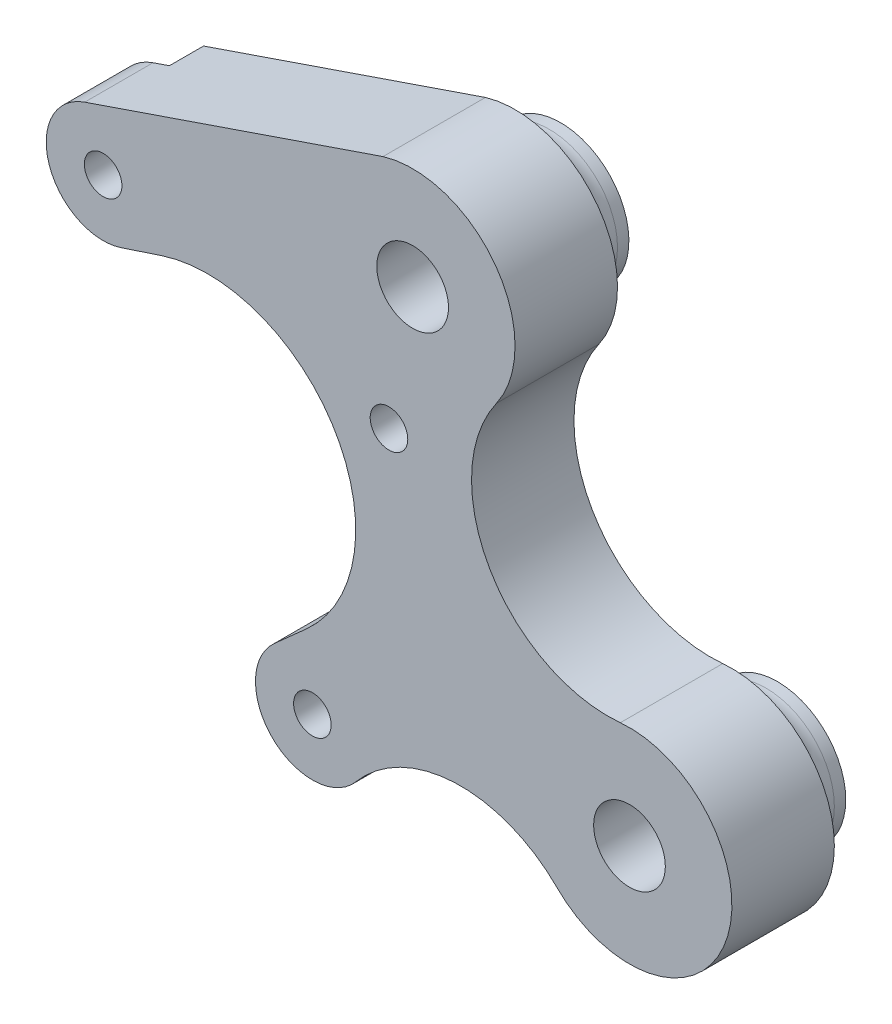
ISO-10303-21;
HEADER;
FILE_DESCRIPTION(('STEP AP214'),'2;1');
FILE_NAME('part.step','',(''),(''),'','','');
FILE_SCHEMA(('AUTOMOTIVE_DESIGN { 1 0 10303 214 1 1 1 1 }'));
ENDSEC;
DATA;
#1=APPLICATION_CONTEXT('core data for automotive mechanical design processes');
#2=APPLICATION_PROTOCOL_DEFINITION('international standard','automotive_design',2000,#1);
#3=PRODUCT_CONTEXT('',#1,'mechanical');
#4=PRODUCT('Part','Part','',(#3));
#5=PRODUCT_RELATED_PRODUCT_CATEGORY('part','',(#4));
#6=PRODUCT_DEFINITION_FORMATION('','',#4);
#7=PRODUCT_DEFINITION_CONTEXT('part definition',#1,'design');
#8=PRODUCT_DEFINITION('design','',#6,#7);
#9=PRODUCT_DEFINITION_SHAPE('','',#8);
#10=(LENGTH_UNIT() NAMED_UNIT(*) SI_UNIT(.MILLI.,.METRE.));
#11=(NAMED_UNIT(*) PLANE_ANGLE_UNIT() SI_UNIT($,.RADIAN.));
#12=(NAMED_UNIT(*) SI_UNIT($,.STERADIAN.) SOLID_ANGLE_UNIT());
#13=UNCERTAINTY_MEASURE_WITH_UNIT(LENGTH_MEASURE(1.E-05),#10,'distance_accuracy_value','');
#14=(GEOMETRIC_REPRESENTATION_CONTEXT(3) GLOBAL_UNCERTAINTY_ASSIGNED_CONTEXT((#13)) GLOBAL_UNIT_ASSIGNED_CONTEXT((#10,
#11,#12)) REPRESENTATION_CONTEXT('',''));
#15=CARTESIAN_POINT('',(0.,0.,0.));
#16=DIRECTION('',(0.,0.,1.));
#17=DIRECTION('',(1.,0.,0.));
#18=AXIS2_PLACEMENT_3D('',#15,#16,#17);
#19=CARTESIAN_POINT('',(22.2096894601271,-26.8555694964484,0.));
#20=DIRECTION('',(0.,0.,1.));
#21=DIRECTION('',(1.,0.,0.));
#22=AXIS2_PLACEMENT_3D('',#19,#20,#21);
#23=PLANE('',#22);
#24=DIRECTION('',(-0.946197404483314,-0.323589974735066,0.));
#25=VECTOR('',#24,1.);
#26=CARTESIAN_POINT('',(15.3980537674445,29.6156761663198,0.));
#27=LINE('',#26,#25);
#28=CARTESIAN_POINT('',(14.7811488401448,29.4047008995382,0.));
#29=VERTEX_POINT('',#28);
#30=CARTESIAN_POINT('',(-9.36933806097773,21.1454778144345,0.));
#31=VERTEX_POINT('',#30);
#32=EDGE_CURVE('E268',#29,#31,#27,.T.);
#33=ORIENTED_EDGE('',*,*,#32,.F.);
#34=CARTESIAN_POINT('',(18.,21.,0.));
#35=DIRECTION('',(0.,0.,1.));
#36=DIRECTION('',(1.,0.,0.));
#37=AXIS2_PLACEMENT_3D('',#34,#35,#36);
#38=CIRCLE('',#37,9.);
#39=CARTESIAN_POINT('',(10.6716496999678,15.7755113283673,0.));
#40=VERTEX_POINT('',#39);
#41=EDGE_CURVE('E312',#29,#40,#38,.T.);
#42=ORIENTED_EDGE('',*,*,#41,.T.);
#43=DIRECTION('',(0.96592582628907,-0.258819045102514,0.));
#44=VECTOR('',#43,1.);
#45=CARTESIAN_POINT('',(-10.7960704087799,21.5277695948435,0.));
#46=LINE('',#45,#44);
#47=EDGE_CURVE('E184',#31,#40,#46,.T.);
#48=ORIENTED_EDGE('',*,*,#47,.F.);
#49=EDGE_LOOP('',(#33,#42,#48));
#50=FACE_BOUND('',#49,.T.);
#51=ADVANCED_FACE('F35',(#50),#23,.F.);
#52=CARTESIAN_POINT('',(35.1748892784926,8.915994940769,0.));
#53=DIRECTION('',(0.,0.,-1.));
#54=DIRECTION('',(1.,0.,0.));
#55=AXIS2_PLACEMENT_3D('',#52,#53,#54);
#56=CIRCLE('',#55,12.);
#57=CARTESIAN_POINT('',(36.2478096907825,-3.03594388893104,0.));
#58=VERTEX_POINT('',#57);
#59=CARTESIAN_POINT('',(25.3606668336397,15.821140688901,0.));
#60=VERTEX_POINT('',#59);
#61=EDGE_CURVE('E263',#58,#60,#56,.T.);
#62=ORIENTED_EDGE('',*,*,#61,.F.);
#63=CARTESIAN_POINT('',(37.0524999999999,-11.9998980112061,0.));
#64=DIRECTION('',(0.,0.,1.));
#65=DIRECTION('',(1.,0.,0.));
#66=AXIS2_PLACEMENT_3D('',#63,#64,#65);
#67=CIRCLE('',#66,9.);
#68=CARTESIAN_POINT('',(30.6912954829116,-18.3666143620242,0.));
#69=VERTEX_POINT('',#68);
#70=EDGE_CURVE('E314',#58,#69,#67,.T.);
#71=ORIENTED_EDGE('',*,*,#70,.T.);
#72=CARTESIAN_POINT('',(22.2096894601271,-26.8555694964484,0.));
#73=DIRECTION('',(0.,0.,-1.));
#74=DIRECTION('',(1.,0.,0.));
#75=AXIS2_PLACEMENT_3D('',#72,#73,#74);
#76=CIRCLE('',#75,12.);
#77=CARTESIAN_POINT('',(13.7083588517206,-18.3863677698056,0.));
#78=VERTEX_POINT('',#77);
#79=EDGE_CURVE('E183',#78,#69,#76,.T.);
#80=ORIENTED_EDGE('',*,*,#79,.F.);
#81=DIRECTION('',(-0.258819045102514,-0.96592582628907,0.));
#82=VECTOR('',#81,1.);
#83=CARTESIAN_POINT('',(21.5277695948435,10.7960704087799,0.));
#84=LINE('',#83,#82);
#85=CARTESIAN_POINT('',(21.5277695948435,10.7960704087799,0.));
#86=VERTEX_POINT('',#85);
#87=EDGE_CURVE('E166',#86,#78,#84,.T.);
#88=ORIENTED_EDGE('',*,*,#87,.F.);
#89=DIRECTION('',(0.500000000000005,-0.866025403784436,0.));
#90=VECTOR('',#89,1.);
#91=CARTESIAN_POINT('',(20.1135560324704,13.245560151563,0.));
#92=LINE('',#91,#90);
#93=CARTESIAN_POINT('',(20.6094760717162,12.3866014470977,0.));
#94=VERTEX_POINT('',#93);
#95=EDGE_CURVE('E158',#94,#86,#92,.T.);
#96=ORIENTED_EDGE('',*,*,#95,.F.);
#97=CARTESIAN_POINT('',(18.,21.,0.));
#98=DIRECTION('',(0.,0.,1.));
#99=DIRECTION('',(1.,0.,0.));
#100=AXIS2_PLACEMENT_3D('',#97,#98,#99);
#101=CIRCLE('',#100,9.);
#102=EDGE_CURVE('E310',#94,#60,#101,.T.);
#103=ORIENTED_EDGE('',*,*,#102,.T.);
#104=EDGE_LOOP('',(#62,#71,#80,#88,#96,#103));
#105=FACE_BOUND('',#104,.T.);
#106=ADVANCED_FACE('F180',(#105),#23,.F.);
#107=CARTESIAN_POINT('',(22.2096894601271,-26.8555694964484,9.));
#108=DIRECTION('',(0.,0.,1.));
#109=DIRECTION('',(1.,0.,0.));
#110=AXIS2_PLACEMENT_3D('',#107,#108,#109);
#111=PLANE('',#110);
#112=CARTESIAN_POINT('',(18.,21.,9.));
#113=DIRECTION('',(0.,0.,1.));
#114=DIRECTION('',(1.,0.,0.));
#115=AXIS2_PLACEMENT_3D('',#112,#113,#114);
#116=CIRCLE('',#115,3.15);
#117=CARTESIAN_POINT('',(21.15,21.,9.));
#118=VERTEX_POINT('',#117);
#119=EDGE_CURVE('E225',#118,#118,#116,.T.);
#120=ORIENTED_EDGE('',*,*,#119,.F.);
#121=EDGE_LOOP('',(#120));
#122=FACE_BOUND('',#121,.T.);
#123=CARTESIAN_POINT('',(15.9216833280906,9.19238815542522,9.));
#124=DIRECTION('',(0.,0.,1.));
#125=DIRECTION('',(1.,0.,0.));
#126=AXIS2_PLACEMENT_3D('',#123,#124,#125);
#127=CIRCLE('',#126,1.65);
#128=CARTESIAN_POINT('',(17.5716833280906,9.19238815542522,9.));
#129=VERTEX_POINT('',#128);
#130=EDGE_CURVE('E231',#129,#129,#127,.T.);
#131=ORIENTED_EDGE('',*,*,#130,.F.);
#132=EDGE_LOOP('',(#131));
#133=FACE_BOUND('',#132,.T.);
#134=CARTESIAN_POINT('',(22.2096894601271,-26.8555694964484,9.));
#135=DIRECTION('',(0.,0.,-1.));
#136=DIRECTION('',(1.,0.,0.));
#137=AXIS2_PLACEMENT_3D('',#134,#135,#136);
#138=CIRCLE('',#137,12.);
#139=CARTESIAN_POINT('',(13.0210061862199,-19.137532201137,9.));
#140=VERTEX_POINT('',#139);
#141=CARTESIAN_POINT('',(30.6912954829116,-18.3666143620242,9.));
#142=VERTEX_POINT('',#141);
#143=EDGE_CURVE('E237',#140,#142,#138,.T.);
#144=ORIENTED_EDGE('',*,*,#143,.T.);
#145=CARTESIAN_POINT('',(37.0524999999999,-11.9998980112061,9.));
#146=DIRECTION('',(0.,0.,1.));
#147=DIRECTION('',(1.,0.,0.));
#148=AXIS2_PLACEMENT_3D('',#145,#146,#147);
#149=CIRCLE('',#148,9.);
#150=CARTESIAN_POINT('',(36.2478096907825,-3.03594388893104,9.));
#151=VERTEX_POINT('',#150);
#152=EDGE_CURVE('E240',#142,#151,#149,.T.);
#153=ORIENTED_EDGE('',*,*,#152,.T.);
#154=CARTESIAN_POINT('',(35.1748892784926,8.915994940769,9.));
#155=DIRECTION('',(0.,0.,-1.));
#156=DIRECTION('',(1.,0.,0.));
#157=AXIS2_PLACEMENT_3D('',#154,#155,#156);
#158=CIRCLE('',#157,12.);
#159=CARTESIAN_POINT('',(25.3606668336397,15.821140688901,9.));
#160=VERTEX_POINT('',#159);
#161=EDGE_CURVE('E243',#151,#160,#158,.T.);
#162=ORIENTED_EDGE('',*,*,#161,.T.);
#163=CARTESIAN_POINT('',(18.,21.,9.));
#164=DIRECTION('',(0.,0.,1.));
#165=DIRECTION('',(1.,0.,0.));
#166=AXIS2_PLACEMENT_3D('',#163,#164,#165);
#167=CIRCLE('',#166,9.);
#168=CARTESIAN_POINT('',(15.3980537674445,29.6156761663198,9.));
#169=VERTEX_POINT('',#168);
#170=EDGE_CURVE('E245',#160,#169,#167,.T.);
#171=ORIENTED_EDGE('',*,*,#170,.T.);
#172=DIRECTION('',(-0.946197404483314,-0.323589974735066,0.));
#173=VECTOR('',#172,1.);
#174=CARTESIAN_POINT('',(15.3980537674445,29.6156761663198,9.));
#175=LINE('',#174,#173);
#176=CARTESIAN_POINT('',(-10.8103380291006,20.6526703505072,9.));
#177=VERTEX_POINT('',#176);
#178=EDGE_CURVE('E247',#169,#177,#175,.T.);
#179=ORIENTED_EDGE('',*,*,#178,.T.);
#180=CARTESIAN_POINT('',(-9.19238815542523,15.9216833280906,9.));
#181=DIRECTION('',(0.,0.,1.));
#182=DIRECTION('',(1.,0.,0.));
#183=AXIS2_PLACEMENT_3D('',#180,#181,#182);
#184=CIRCLE('',#183,5.);
#185=CARTESIAN_POINT('',(-7.62597539265558,11.1733835211458,9.));
#186=VERTEX_POINT('',#185);
#187=EDGE_CURVE('E249',#177,#186,#184,.T.);
#188=ORIENTED_EDGE('',*,*,#187,.T.);
#189=DIRECTION('',(0.949659961388967,0.313282552553928,0.));
#190=VECTOR('',#189,1.);
#191=CARTESIAN_POINT('',(-4.07267318320107,12.3455794980566,9.));
#192=LINE('',#191,#190);
#193=CARTESIAN_POINT('',(-4.07267318320107,12.3455794980566,9.));
#194=VERTEX_POINT('',#193);
#195=EDGE_CURVE('E251',#186,#194,#192,.T.);
#196=ORIENTED_EDGE('',*,*,#195,.T.);
#197=CARTESIAN_POINT('',(0.,0.,9.));
#198=DIRECTION('',(0.,0.,-1.));
#199=DIRECTION('',(1.,0.,0.));
#200=AXIS2_PLACEMENT_3D('',#197,#198,#199);
#201=CIRCLE('',#200,13.);
#202=CARTESIAN_POINT('',(8.65524887815692,-9.69982818699195,9.));
#203=VERTEX_POINT('',#202);
#204=EDGE_CURVE('E253',#194,#203,#201,.T.);
#205=ORIENTED_EDGE('',*,*,#204,.T.);
#206=DIRECTION('',(-0.746140629768612,-0.665788375242839,0.));
#207=VECTOR('',#206,1.);
#208=CARTESIAN_POINT('',(8.65524887815692,-9.69982818699195,9.));
#209=LINE('',#208,#207);
#210=CARTESIAN_POINT('',(5.86344627921102,-12.1909801792475,9.));
#211=VERTEX_POINT('',#210);
#212=EDGE_CURVE('E255',#203,#211,#209,.T.);
#213=ORIENTED_EDGE('',*,*,#212,.T.);
#214=CARTESIAN_POINT('',(9.19238815542522,-15.9216833280906,9.));
#215=DIRECTION('',(0.,0.,1.));
#216=DIRECTION('',(1.,0.,0.));
#217=AXIS2_PLACEMENT_3D('',#214,#215,#216);
#218=CIRCLE('',#217,5.);
#219=EDGE_CURVE('E257',#211,#140,#218,.T.);
#220=ORIENTED_EDGE('',*,*,#219,.T.);
#221=EDGE_LOOP('',(#144,#153,#162,#171,#179,#188,#196,#205,#213,#220));
#222=FACE_BOUND('',#221,.T.);
#223=CARTESIAN_POINT('',(-9.19238815542523,15.9216833280906,9.));
#224=DIRECTION('',(0.,0.,1.));
#225=DIRECTION('',(1.,0.,0.));
#226=AXIS2_PLACEMENT_3D('',#223,#224,#225);
#227=CIRCLE('',#226,1.65);
#228=CARTESIAN_POINT('',(-7.54238815542522,15.9216833280906,9.));
#229=VERTEX_POINT('',#228);
#230=EDGE_CURVE('E234',#229,#229,#227,.T.);
#231=ORIENTED_EDGE('',*,*,#230,.F.);
#232=EDGE_LOOP('',(#231));
#233=FACE_BOUND('',#232,.T.);
#234=CARTESIAN_POINT('',(9.19238815542522,-15.9216833280906,9.));
#235=DIRECTION('',(0.,0.,1.));
#236=DIRECTION('',(1.,0.,0.));
#237=AXIS2_PLACEMENT_3D('',#234,#235,#236);
#238=CIRCLE('',#237,1.65);
#239=CARTESIAN_POINT('',(10.8423881554252,-15.9216833280906,9.));
#240=VERTEX_POINT('',#239);
#241=EDGE_CURVE('E228',#240,#240,#238,.T.);
#242=ORIENTED_EDGE('',*,*,#241,.F.);
#243=EDGE_LOOP('',(#242));
#244=FACE_BOUND('',#243,.T.);
#245=CARTESIAN_POINT('',(37.0524999999999,-11.9998980112061,9.));
#246=DIRECTION('',(0.,0.,1.));
#247=DIRECTION('',(1.,0.,0.));
#248=AXIS2_PLACEMENT_3D('',#245,#246,#247);
#249=CIRCLE('',#248,3.14999999999999);
#250=CARTESIAN_POINT('',(40.2024999999999,-11.9998980112061,9.));
#251=VERTEX_POINT('',#250);
#252=EDGE_CURVE('E222',#251,#251,#249,.T.);
#253=ORIENTED_EDGE('',*,*,#252,.F.);
#254=EDGE_LOOP('',(#253));
#255=FACE_BOUND('',#254,.T.);
#256=ADVANCED_FACE('F398',(#122,#133,#222,#233,#244,#255),#111,.T.);
#257=CARTESIAN_POINT('',(22.2096894601271,-26.8555694964484,9.));
#258=DIRECTION('',(0.,0.,-1.));
#259=DIRECTION('',(-1.,0.,0.));
#260=AXIS2_PLACEMENT_3D('',#257,#258,#259);
#261=CYLINDRICAL_SURFACE('',#260,12.);
#262=DIRECTION('',(0.,0.,-1.));
#263=VECTOR('',#262,1.);
#264=CARTESIAN_POINT('',(13.0210061862199,-19.137532201137,9.));
#265=LINE('',#264,#263);
#266=CARTESIAN_POINT('',(13.0210061862199,-19.137532201137,3.));
#267=VERTEX_POINT('',#266);
#268=EDGE_CURVE('E259',#140,#267,#265,.T.);
#269=ORIENTED_EDGE('',*,*,#268,.T.);
#270=CARTESIAN_POINT('',(22.2096894601271,-26.8555694964484,3.));
#271=DIRECTION('',(0.,0.,1.));
#272=DIRECTION('',(1.,0.,0.));
#273=AXIS2_PLACEMENT_3D('',#270,#271,#272);
#274=CIRCLE('',#273,12.);
#275=CARTESIAN_POINT('',(13.7083588517206,-18.3863677698056,3.));
#276=VERTEX_POINT('',#275);
#277=EDGE_CURVE('E219',#267,#276,#274,.F.);
#278=ORIENTED_EDGE('',*,*,#277,.T.);
#279=DIRECTION('',(0.,0.,-1.));
#280=VECTOR('',#279,1.);
#281=CARTESIAN_POINT('',(13.7083588517206,-18.3863677698056,9.));
#282=LINE('',#281,#280);
#283=EDGE_CURVE('E305',#276,#78,#282,.T.);
#284=ORIENTED_EDGE('',*,*,#283,.T.);
#285=ORIENTED_EDGE('',*,*,#79,.T.);
#286=DIRECTION('',(0.,0.,-1.));
#287=VECTOR('',#286,1.);
#288=CARTESIAN_POINT('',(30.6912954829116,-18.3666143620242,9.));
#289=LINE('',#288,#287);
#290=EDGE_CURVE('E297',#142,#69,#289,.T.);
#291=ORIENTED_EDGE('',*,*,#290,.F.);
#292=ORIENTED_EDGE('',*,*,#143,.F.);
#293=EDGE_LOOP('',(#269,#278,#284,#285,#291,#292));
#294=FACE_BOUND('',#293,.T.);
#295=ADVANCED_FACE('F336',(#294),#261,.F.);
#296=CARTESIAN_POINT('',(37.0524999999999,-11.9998980112061,9.));
#297=DIRECTION('',(0.,0.,-1.));
#298=DIRECTION('',(-1.,0.,0.));
#299=AXIS2_PLACEMENT_3D('',#296,#297,#298);
#300=CYLINDRICAL_SURFACE('',#299,9.);
#301=CARTESIAN_POINT('',(37.0524999999999,-11.9998980112061,0.));
#302=DIRECTION('',(0.,0.,1.));
#303=DIRECTION('',(1.,0.,0.));
#304=AXIS2_PLACEMENT_3D('',#301,#302,#303);
#305=CIRCLE('',#304,9.);
#306=EDGE_CURVE('E261',#69,#58,#305,.T.);
#307=ORIENTED_EDGE('',*,*,#306,.T.);
#308=DIRECTION('',(0.,0.,-1.));
#309=VECTOR('',#308,1.);
#310=CARTESIAN_POINT('',(36.2478096907825,-3.03594388893104,9.));
#311=LINE('',#310,#309);
#312=EDGE_CURVE('E294',#151,#58,#311,.T.);
#313=ORIENTED_EDGE('',*,*,#312,.F.);
#314=ORIENTED_EDGE('',*,*,#152,.F.);
#315=ORIENTED_EDGE('',*,*,#290,.T.);
#316=EDGE_LOOP('',(#307,#313,#314,#315));
#317=FACE_BOUND('',#316,.T.);
#318=ADVANCED_FACE('F405',(#317),#300,.T.);
#319=CARTESIAN_POINT('',(35.1748892784926,8.915994940769,9.));
#320=DIRECTION('',(0.,0.,-1.));
#321=DIRECTION('',(-1.,0.,0.));
#322=AXIS2_PLACEMENT_3D('',#319,#320,#321);
#323=CYLINDRICAL_SURFACE('',#322,12.);
#324=ORIENTED_EDGE('',*,*,#61,.T.);
#325=DIRECTION('',(0.,0.,-1.));
#326=VECTOR('',#325,1.);
#327=CARTESIAN_POINT('',(25.3606668336397,15.821140688901,9.));
#328=LINE('',#327,#326);
#329=EDGE_CURVE('E291',#160,#60,#328,.T.);
#330=ORIENTED_EDGE('',*,*,#329,.F.);
#331=ORIENTED_EDGE('',*,*,#161,.F.);
#332=ORIENTED_EDGE('',*,*,#312,.T.);
#333=EDGE_LOOP('',(#324,#330,#331,#332));
#334=FACE_BOUND('',#333,.T.);
#335=ADVANCED_FACE('F528',(#334),#323,.F.);
#336=CARTESIAN_POINT('',(18.,21.,9.));
#337=DIRECTION('',(0.,0.,-1.));
#338=DIRECTION('',(-1.,0.,0.));
#339=AXIS2_PLACEMENT_3D('',#336,#337,#338);
#340=CYLINDRICAL_SURFACE('',#339,9.);
#341=CARTESIAN_POINT('',(18.,21.,0.));
#342=DIRECTION('',(0.,0.,1.));
#343=DIRECTION('',(1.,0.,0.));
#344=AXIS2_PLACEMENT_3D('',#341,#342,#343);
#345=CIRCLE('',#344,9.);
#346=CARTESIAN_POINT('',(15.3980537674445,29.6156761663198,0.));
#347=VERTEX_POINT('',#346);
#348=EDGE_CURVE('E266',#60,#347,#345,.T.);
#349=ORIENTED_EDGE('',*,*,#348,.T.);
#350=DIRECTION('',(0.,0.,-1.));
#351=VECTOR('',#350,1.);
#352=CARTESIAN_POINT('',(15.3980537674445,29.6156761663198,9.));
#353=LINE('',#352,#351);
#354=EDGE_CURVE('E288',#169,#347,#353,.T.);
#355=ORIENTED_EDGE('',*,*,#354,.F.);
#356=ORIENTED_EDGE('',*,*,#170,.F.);
#357=ORIENTED_EDGE('',*,*,#329,.T.);
#358=EDGE_LOOP('',(#349,#355,#356,#357));
#359=FACE_BOUND('',#358,.T.);
#360=ADVANCED_FACE('F537',(#359),#340,.T.);
#361=CARTESIAN_POINT('',(15.3980537674445,29.6156761663198,9.));
#362=DIRECTION('',(0.323589974735066,-0.946197404483314,0.));
#363=DIRECTION('',(0.946197404483314,0.323589974735066,0.));
#364=AXIS2_PLACEMENT_3D('',#361,#362,#363);
#365=PLANE('',#364);
#366=DIRECTION('',(0.,0.,1.));
#367=VECTOR('',#366,1.);
#368=CARTESIAN_POINT('',(-9.36933806097773,21.1454778144345,9.));
#369=LINE('',#368,#367);
#370=CARTESIAN_POINT('',(-9.36933806097773,21.1454778144345,3.));
#371=VERTEX_POINT('',#370);
#372=EDGE_CURVE('E300',#31,#371,#369,.T.);
#373=ORIENTED_EDGE('',*,*,#372,.T.);
#374=DIRECTION('',(-0.946197404483314,-0.323589974735066,0.));
#375=VECTOR('',#374,1.);
#376=CARTESIAN_POINT('',(15.3980537674445,29.6156761663198,3.));
#377=LINE('',#376,#375);
#378=CARTESIAN_POINT('',(-10.8103380291006,20.6526703505072,3.));
#379=VERTEX_POINT('',#378);
#380=EDGE_CURVE('E216',#371,#379,#377,.T.);
#381=ORIENTED_EDGE('',*,*,#380,.T.);
#382=DIRECTION('',(0.,0.,-1.));
#383=VECTOR('',#382,1.);
#384=CARTESIAN_POINT('',(-10.8103380291006,20.6526703505072,9.));
#385=LINE('',#384,#383);
#386=EDGE_CURVE('E285',#177,#379,#385,.T.);
#387=ORIENTED_EDGE('',*,*,#386,.F.);
#388=ORIENTED_EDGE('',*,*,#178,.F.);
#389=ORIENTED_EDGE('',*,*,#354,.T.);
#390=EDGE_CURVE('E241',#347,#29,#27,.T.);
#391=ORIENTED_EDGE('',*,*,#390,.T.);
#392=ORIENTED_EDGE('',*,*,#32,.T.);
#393=EDGE_LOOP('',(#373,#381,#387,#388,#389,#391,#392));
#394=FACE_BOUND('',#393,.T.);
#395=ADVANCED_FACE('F351',(#394),#365,.F.);
#396=CARTESIAN_POINT('',(-9.19238815542523,15.9216833280906,9.));
#397=DIRECTION('',(0.,0.,-1.));
#398=DIRECTION('',(-1.,0.,0.));
#399=AXIS2_PLACEMENT_3D('',#396,#397,#398);
#400=CYLINDRICAL_SURFACE('',#399,5.);
#401=ORIENTED_EDGE('',*,*,#386,.T.);
#402=CARTESIAN_POINT('',(-9.19238815542523,15.9216833280906,3.));
#403=DIRECTION('',(0.,0.,1.));
#404=DIRECTION('',(1.,0.,0.));
#405=AXIS2_PLACEMENT_3D('',#402,#403,#404);
#406=CIRCLE('',#405,5.);
#407=CARTESIAN_POINT('',(-7.62597539265558,11.1733835211458,3.));
#408=VERTEX_POINT('',#407);
#409=EDGE_CURVE('E213',#379,#408,#406,.T.);
#410=ORIENTED_EDGE('',*,*,#409,.T.);
#411=DIRECTION('',(0.,0.,-1.));
#412=VECTOR('',#411,1.);
#413=CARTESIAN_POINT('',(-7.62597539265558,11.1733835211458,9.));
#414=LINE('',#413,#412);
#415=EDGE_CURVE('E282',#186,#408,#414,.T.);
#416=ORIENTED_EDGE('',*,*,#415,.F.);
#417=ORIENTED_EDGE('',*,*,#187,.F.);
#418=EDGE_LOOP('',(#401,#410,#416,#417));
#419=FACE_BOUND('',#418,.T.);
#420=ADVANCED_FACE('F554',(#419),#400,.T.);
#421=CARTESIAN_POINT('',(-4.07267318320107,12.3455794980566,9.));
#422=DIRECTION('',(-0.313282552553928,0.949659961388967,0.));
#423=DIRECTION('',(-0.949659961388968,-0.313282552553928,0.));
#424=AXIS2_PLACEMENT_3D('',#421,#422,#423);
#425=PLANE('',#424);
#426=ORIENTED_EDGE('',*,*,#415,.T.);
#427=DIRECTION('',(0.949659961388968,0.313282552553928,0.));
#428=VECTOR('',#427,1.);
#429=CARTESIAN_POINT('',(-4.07267318320107,12.3455794980566,3.));
#430=LINE('',#429,#428);
#431=CARTESIAN_POINT('',(-4.07267318320107,12.3455794980566,3.));
#432=VERTEX_POINT('',#431);
#433=EDGE_CURVE('E210',#408,#432,#430,.T.);
#434=ORIENTED_EDGE('',*,*,#433,.T.);
#435=DIRECTION('',(0.,0.,-1.));
#436=VECTOR('',#435,1.);
#437=CARTESIAN_POINT('',(-4.07267318320107,12.3455794980566,9.));
#438=LINE('',#437,#436);
#439=EDGE_CURVE('E279',#194,#432,#438,.T.);
#440=ORIENTED_EDGE('',*,*,#439,.F.);
#441=ORIENTED_EDGE('',*,*,#195,.F.);
#442=EDGE_LOOP('',(#426,#434,#440,#441));
#443=FACE_BOUND('',#442,.T.);
#444=ADVANCED_FACE('F633',(#443),#425,.F.);
#445=CARTESIAN_POINT('',(0.,0.,9.));
#446=DIRECTION('',(0.,0.,-1.));
#447=DIRECTION('',(-1.,0.,0.));
#448=AXIS2_PLACEMENT_3D('',#445,#446,#447);
#449=CYLINDRICAL_SURFACE('',#448,13.);
#450=ORIENTED_EDGE('',*,*,#439,.T.);
#451=CARTESIAN_POINT('',(0.,0.,3.));
#452=DIRECTION('',(0.,0.,1.));
#453=DIRECTION('',(1.,0.,0.));
#454=AXIS2_PLACEMENT_3D('',#451,#452,#453);
#455=CIRCLE('',#454,13.);
#456=CARTESIAN_POINT('',(8.65524887815692,-9.69982818699195,3.));
#457=VERTEX_POINT('',#456);
#458=EDGE_CURVE('E207',#432,#457,#455,.F.);
#459=ORIENTED_EDGE('',*,*,#458,.T.);
#460=DIRECTION('',(0.,0.,-1.));
#461=VECTOR('',#460,1.);
#462=CARTESIAN_POINT('',(8.65524887815692,-9.69982818699195,9.));
#463=LINE('',#462,#461);
#464=EDGE_CURVE('E276',#203,#457,#463,.T.);
#465=ORIENTED_EDGE('',*,*,#464,.F.);
#466=ORIENTED_EDGE('',*,*,#204,.F.);
#467=EDGE_LOOP('',(#450,#459,#465,#466));
#468=FACE_BOUND('',#467,.T.);
#469=ADVANCED_FACE('F624',(#468),#449,.F.);
#470=CARTESIAN_POINT('',(8.65524887815692,-9.69982818699195,9.));
#471=DIRECTION('',(0.665788375242839,-0.746140629768612,0.));
#472=DIRECTION('',(0.746140629768612,0.665788375242839,0.));
#473=AXIS2_PLACEMENT_3D('',#470,#471,#472);
#474=PLANE('',#473);
#475=ORIENTED_EDGE('',*,*,#464,.T.);
#476=DIRECTION('',(-0.746140629768612,-0.665788375242839,0.));
#477=VECTOR('',#476,1.);
#478=CARTESIAN_POINT('',(8.65524887815692,-9.69982818699195,3.));
#479=LINE('',#478,#477);
#480=CARTESIAN_POINT('',(5.86344627921103,-12.1909801792475,3.));
#481=VERTEX_POINT('',#480);
#482=EDGE_CURVE('E204',#457,#481,#479,.T.);
#483=ORIENTED_EDGE('',*,*,#482,.T.);
#484=DIRECTION('',(0.,0.,-1.));
#485=VECTOR('',#484,1.);
#486=CARTESIAN_POINT('',(5.86344627921102,-12.1909801792475,9.));
#487=LINE('',#486,#485);
#488=EDGE_CURVE('E273',#211,#481,#487,.T.);
#489=ORIENTED_EDGE('',*,*,#488,.F.);
#490=ORIENTED_EDGE('',*,*,#212,.F.);
#491=EDGE_LOOP('',(#475,#483,#489,#490));
#492=FACE_BOUND('',#491,.T.);
#493=ADVANCED_FACE('F616',(#492),#474,.F.);
#494=CARTESIAN_POINT('',(9.19238815542522,-15.9216833280906,9.));
#495=DIRECTION('',(0.,0.,-1.));
#496=DIRECTION('',(-1.,0.,0.));
#497=AXIS2_PLACEMENT_3D('',#494,#495,#496);
#498=CYLINDRICAL_SURFACE('',#497,5.);
#499=ORIENTED_EDGE('',*,*,#488,.T.);
#500=CARTESIAN_POINT('',(9.19238815542522,-15.9216833280906,3.));
#501=DIRECTION('',(0.,0.,1.));
#502=DIRECTION('',(1.,0.,0.));
#503=AXIS2_PLACEMENT_3D('',#500,#501,#502);
#504=CIRCLE('',#503,5.);
#505=EDGE_CURVE('E201',#481,#267,#504,.T.);
#506=ORIENTED_EDGE('',*,*,#505,.T.);
#507=ORIENTED_EDGE('',*,*,#268,.F.);
#508=ORIENTED_EDGE('',*,*,#219,.F.);
#509=EDGE_LOOP('',(#499,#506,#507,#508));
#510=FACE_BOUND('',#509,.T.);
#511=ADVANCED_FACE('F396',(#510),#498,.T.);
#512=CARTESIAN_POINT('',(-9.19238815542523,15.9216833280906,9.));
#513=DIRECTION('',(0.,0.,-1.));
#514=DIRECTION('',(-1.,0.,0.));
#515=AXIS2_PLACEMENT_3D('',#512,#513,#514);
#516=CYLINDRICAL_SURFACE('',#515,1.65);
#517=CARTESIAN_POINT('',(-9.19238815542523,15.9216833280906,3.));
#518=DIRECTION('',(0.,0.,1.));
#519=DIRECTION('',(1.,0.,0.));
#520=AXIS2_PLACEMENT_3D('',#517,#518,#519);
#521=CIRCLE('',#520,1.65);
#522=CARTESIAN_POINT('',(-7.54238815542522,15.9216833280906,3.));
#523=VERTEX_POINT('',#522);
#524=EDGE_CURVE('E198',#523,#523,#521,.T.);
#525=ORIENTED_EDGE('',*,*,#524,.F.);
#526=EDGE_LOOP('',(#525));
#527=FACE_BOUND('',#526,.T.);
#528=ORIENTED_EDGE('',*,*,#230,.T.);
#529=EDGE_LOOP('',(#528));
#530=FACE_BOUND('',#529,.T.);
#531=ADVANCED_FACE('F393',(#527,#530),#516,.F.);
#532=CARTESIAN_POINT('',(15.9216833280906,9.19238815542522,9.));
#533=DIRECTION('',(0.,0.,-1.));
#534=DIRECTION('',(-1.,0.,0.));
#535=AXIS2_PLACEMENT_3D('',#532,#533,#534);
#536=CYLINDRICAL_SURFACE('',#535,1.65);
#537=CARTESIAN_POINT('',(15.9216833280906,9.19238815542522,3.));
#538=DIRECTION('',(0.,0.,1.));
#539=DIRECTION('',(1.,0.,0.));
#540=AXIS2_PLACEMENT_3D('',#537,#538,#539);
#541=CIRCLE('',#540,1.65);
#542=CARTESIAN_POINT('',(17.5716833280906,9.19238815542522,3.));
#543=VERTEX_POINT('',#542);
#544=EDGE_CURVE('E195',#543,#543,#541,.T.);
#545=ORIENTED_EDGE('',*,*,#544,.F.);
#546=EDGE_LOOP('',(#545));
#547=FACE_BOUND('',#546,.T.);
#548=ORIENTED_EDGE('',*,*,#130,.T.);
#549=EDGE_LOOP('',(#548));
#550=FACE_BOUND('',#549,.T.);
#551=ADVANCED_FACE('F389',(#547,#550),#536,.F.);
#552=CARTESIAN_POINT('',(9.19238815542522,-15.9216833280906,9.));
#553=DIRECTION('',(0.,0.,-1.));
#554=DIRECTION('',(-1.,0.,0.));
#555=AXIS2_PLACEMENT_3D('',#552,#553,#554);
#556=CYLINDRICAL_SURFACE('',#555,1.65);
#557=CARTESIAN_POINT('',(9.19238815542522,-15.9216833280906,3.));
#558=DIRECTION('',(0.,0.,1.));
#559=DIRECTION('',(1.,0.,0.));
#560=AXIS2_PLACEMENT_3D('',#557,#558,#559);
#561=CIRCLE('',#560,1.65);
#562=CARTESIAN_POINT('',(10.8423881554252,-15.9216833280906,3.));
#563=VERTEX_POINT('',#562);
#564=EDGE_CURVE('E175',#563,#563,#561,.T.);
#565=ORIENTED_EDGE('',*,*,#564,.F.);
#566=EDGE_LOOP('',(#565));
#567=FACE_BOUND('',#566,.T.);
#568=ORIENTED_EDGE('',*,*,#241,.T.);
#569=EDGE_LOOP('',(#568));
#570=FACE_BOUND('',#569,.T.);
#571=ADVANCED_FACE('F385',(#567,#570),#556,.F.);
#572=CARTESIAN_POINT('',(18.,21.,9.));
#573=DIRECTION('',(0.,0.,-1.));
#574=DIRECTION('',(-1.,0.,0.));
#575=AXIS2_PLACEMENT_3D('',#572,#573,#574);
#576=CYLINDRICAL_SURFACE('',#575,3.15);
#577=ORIENTED_EDGE('',*,*,#119,.T.);
#578=EDGE_LOOP('',(#577));
#579=FACE_BOUND('',#578,.T.);
#580=CARTESIAN_POINT('',(18.,21.,-4.));
#581=DIRECTION('',(0.,0.,-1.));
#582=DIRECTION('',(-1.,0.,0.));
#583=AXIS2_PLACEMENT_3D('',#580,#581,#582);
#584=CIRCLE('',#583,3.15);
#585=CARTESIAN_POINT('',(14.85,21.,-4.));
#586=VERTEX_POINT('',#585);
#587=EDGE_CURVE('E432',#586,#586,#584,.T.);
#588=ORIENTED_EDGE('',*,*,#587,.T.);
#589=EDGE_LOOP('',(#588));
#590=FACE_BOUND('',#589,.T.);
#591=ADVANCED_FACE('F381',(#579,#590),#576,.F.);
#592=CARTESIAN_POINT('',(37.0524999999999,-11.9998980112061,9.));
#593=DIRECTION('',(0.,0.,-1.));
#594=DIRECTION('',(-1.,0.,0.));
#595=AXIS2_PLACEMENT_3D('',#592,#593,#594);
#596=CYLINDRICAL_SURFACE('',#595,3.14999999999999);
#597=ORIENTED_EDGE('',*,*,#252,.T.);
#598=EDGE_LOOP('',(#597));
#599=FACE_BOUND('',#598,.T.);
#600=CARTESIAN_POINT('',(37.0524999999999,-11.9998980112061,-4.));
#601=DIRECTION('',(0.,0.,-1.));
#602=DIRECTION('',(-1.,0.,0.));
#603=AXIS2_PLACEMENT_3D('',#600,#601,#602);
#604=CIRCLE('',#603,3.14999999999999);
#605=CARTESIAN_POINT('',(33.9024999999999,-11.9998980112061,-4.));
#606=VERTEX_POINT('',#605);
#607=EDGE_CURVE('E359',#606,#606,#604,.T.);
#608=ORIENTED_EDGE('',*,*,#607,.T.);
#609=EDGE_LOOP('',(#608));
#610=FACE_BOUND('',#609,.T.);
#611=ADVANCED_FACE('F375',(#599,#610),#596,.F.);
#612=CARTESIAN_POINT('',(21.5277695948435,10.7960704087799,79.4041740796584));
#613=DIRECTION('',(0.96592582628907,-0.258819045102514,0.));
#614=DIRECTION('',(0.258819045102514,0.96592582628907,0.));
#615=AXIS2_PLACEMENT_3D('',#612,#613,#614);
#616=PLANE('',#615);
#617=DIRECTION('',(-0.258819045102514,-0.96592582628907,0.));
#618=VECTOR('',#617,1.);
#619=CARTESIAN_POINT('',(21.5277695948435,10.7960704087799,3.));
#620=LINE('',#619,#618);
#621=CARTESIAN_POINT('',(21.5277695948435,10.7960704087799,3.));
#622=VERTEX_POINT('',#621);
#623=EDGE_CURVE('E173',#622,#276,#620,.T.);
#624=ORIENTED_EDGE('',*,*,#623,.F.);
#625=DIRECTION('',(0.,0.,-1.));
#626=VECTOR('',#625,1.);
#627=CARTESIAN_POINT('',(21.5277695948435,10.7960704087799,79.4041740796584));
#628=LINE('',#627,#626);
#629=EDGE_CURVE('E161',#622,#86,#628,.T.);
#630=ORIENTED_EDGE('',*,*,#629,.T.);
#631=ORIENTED_EDGE('',*,*,#87,.T.);
#632=ORIENTED_EDGE('',*,*,#283,.F.);
#633=EDGE_LOOP('',(#624,#630,#631,#632));
#634=FACE_BOUND('',#633,.T.);
#635=ADVANCED_FACE('F170',(#634),#616,.F.);
#636=CARTESIAN_POINT('',(-10.7960704087799,21.5277695948435,79.4041740796584));
#637=DIRECTION('',(0.258819045102514,0.96592582628907,0.));
#638=DIRECTION('',(-0.96592582628907,0.258819045102514,0.));
#639=AXIS2_PLACEMENT_3D('',#636,#637,#638);
#640=PLANE('',#639);
#641=ORIENTED_EDGE('',*,*,#47,.T.);
#642=CARTESIAN_POINT('',(10.6716496999678,15.7755113283673,0.));
#643=CARTESIAN_POINT('',(10.8599397831438,15.7250591526375,-3.78537724667511E-06));
#644=CARTESIAN_POINT('',(11.0480358885608,15.6746589530916,-0.00768348374047617));
#645=CARTESIAN_POINT('',(11.4229584961014,15.5741987431769,-0.0355939644988664));
#646=CARTESIAN_POINT('',(11.6097869066717,15.5241382214415,-0.0557963463351493));
#647=CARTESIAN_POINT('',(11.9837339895187,15.4239394025806,-0.106190313089809));
#648=CARTESIAN_POINT('',(12.1708415700177,15.3738040774882,-0.13646554904748));
#649=CARTESIAN_POINT('',(12.544024390333,15.2738100421555,-0.20413467040812));
#650=CARTESIAN_POINT('',(12.7300983449014,15.2239516762964,-0.241535972272669));
#651=CARTESIAN_POINT('',(13.1019933932223,15.1243026984297,-0.320538062928878));
#652=CARTESIAN_POINT('',(13.2878118874065,15.0745127829743,-0.362151588144796));
#653=CARTESIAN_POINT('',(13.6593117174521,14.9749697035253,-0.446141846419949));
#654=CARTESIAN_POINT('',(13.8449930293919,14.9252165459415,-0.488518689767164));
#655=CARTESIAN_POINT('',(14.2166751917789,14.8256246106888,-0.570179299267077));
#656=CARTESIAN_POINT('',(14.4026749383697,14.7757861287974,-0.609468275292696));
#657=CARTESIAN_POINT('',(14.7759991285978,14.6757542135108,-0.680821491068265));
#658=CARTESIAN_POINT('',(14.9633234484802,14.6255608132756,-0.712886396799068));
#659=CARTESIAN_POINT('',(15.3387345556203,14.5249697102878,-0.765381368291295));
#660=CARTESIAN_POINT('',(15.5268144938627,14.4745738427232,-0.7858613801495));
#661=CARTESIAN_POINT('',(15.903918531506,14.3735291203742,-0.812063382983131));
#662=CARTESIAN_POINT('',(16.0929422596079,14.322880365079,-0.817790780030974));
#663=CARTESIAN_POINT('',(16.4709010117213,14.2216066226779,-0.813460442144827));
#664=CARTESIAN_POINT('',(16.6598359485209,14.1709816589404,-0.803395065916172));
#665=CARTESIAN_POINT('',(17.0365341136558,14.0700456898022,-0.769254662092057));
#666=CARTESIAN_POINT('',(17.2242968366006,14.0197348198205,-0.745173963734998));
#667=CARTESIAN_POINT('',(17.523224830193,13.9396373053424,-0.698458037958995));
#668=CARTESIAN_POINT('',(17.6348989615474,13.9097143120305,-0.679118825700914));
#669=CARTESIAN_POINT('',(17.8577387597373,13.850004568064,-0.637679935136701));
#670=CARTESIAN_POINT('',(17.9689045463579,13.8202177853131,-0.615580946006291));
#671=CARTESIAN_POINT('',(18.3019177899446,13.7309871556251,-0.546505521406205));
#672=CARTESIAN_POINT('',(18.5232171634435,13.6716901672106,-0.49676169891149));
#673=CARTESIAN_POINT('',(18.8582198482421,13.5819264683566,-0.420942194882047));
#674=CARTESIAN_POINT('',(18.9719821423294,13.5514439535268,-0.395104519417369));
#675=CARTESIAN_POINT('',(19.1996328593667,13.4904451277402,-0.344063877259297));
#676=CARTESIAN_POINT('',(19.3135212718495,13.4599288195882,-0.318860861491461));
#677=CARTESIAN_POINT('',(19.5415184231634,13.3988371670171,-0.269870225414939));
#678=CARTESIAN_POINT('',(19.65562699991,13.3682618660283,-0.246081808515074));
#679=CARTESIAN_POINT('',(19.8842599387179,13.3069998547116,-0.200609981238863));
#680=CARTESIAN_POINT('',(19.9987843904152,13.2763131203657,-0.178927056514829));
#681=CARTESIAN_POINT('',(20.1135560324704,13.245560151563,-0.158655164864742));
#682=B_SPLINE_CURVE_WITH_KNOTS('',3,(#642,#643,#644,#645,#646,#647,#648,#649,#650,#651,#652,
#653,#654,#655,#656,#657,#658,#659,#660,#661,#662,#663,#664,#665,#666,#667,#668,#669,#670,#671,
#672,#673,#674,#675,#676,#677,#678,#679,#680,#681),.UNSPECIFIED.,.F.,.F.,(4,2,2,2,2,2,2,2,2,2,2,
2,2,2,2,2,2,2,2,4),(0.,0.584358760433732,1.16739706116846,1.75540342419582,2.34402513181766,
2.93448305781883,3.52502699152006,4.11455215430103,4.70402294700318,5.29093258922629,
5.87762712871985,6.4646056264797,7.05182178780525,7.40345095692485,7.75499249160068,
8.45827685366468,8.8200093510514,9.18171379140034,9.54321258079233,9.90479455631949),.UNSPECIFIED.);
#683=CARTESIAN_POINT('',(20.1135560324704,13.245560151563,-0.158655164864741));
#684=VERTEX_POINT('',#683);
#685=EDGE_CURVE('E49',#40,#684,#682,.T.);
#686=ORIENTED_EDGE('',*,*,#685,.T.);
#687=DIRECTION('',(0.,0.,-1.));
#688=VECTOR('',#687,1.);
#689=CARTESIAN_POINT('',(20.1135560324704,13.245560151563,79.4041740796584));
#690=LINE('',#689,#688);
#691=CARTESIAN_POINT('',(20.1135560324704,13.245560151563,3.));
#692=VERTEX_POINT('',#691);
#693=EDGE_CURVE('E56',#692,#684,#690,.T.);
#694=ORIENTED_EDGE('',*,*,#693,.F.);
#695=DIRECTION('',(0.96592582628907,-0.258819045102514,0.));
#696=VECTOR('',#695,1.);
#697=CARTESIAN_POINT('',(-10.7960704087799,21.5277695948435,3.));
#698=LINE('',#697,#696);
#699=EDGE_CURVE('E191',#371,#692,#698,.T.);
#700=ORIENTED_EDGE('',*,*,#699,.F.);
#701=ORIENTED_EDGE('',*,*,#372,.F.);
#702=EDGE_LOOP('',(#641,#686,#694,#700,#701));
#703=FACE_BOUND('',#702,.T.);
#704=ADVANCED_FACE('F368',(#703),#640,.F.);
#705=CARTESIAN_POINT('',(22.2096894601271,-26.8555694964484,3.));
#706=DIRECTION('',(0.,0.,1.));
#707=DIRECTION('',(1.,0.,0.));
#708=AXIS2_PLACEMENT_3D('',#705,#706,#707);
#709=PLANE('',#708);
#710=ORIENTED_EDGE('',*,*,#564,.T.);
#711=EDGE_LOOP('',(#710));
#712=FACE_BOUND('',#711,.T.);
#713=ORIENTED_EDGE('',*,*,#544,.T.);
#714=EDGE_LOOP('',(#713));
#715=FACE_BOUND('',#714,.T.);
#716=ORIENTED_EDGE('',*,*,#524,.T.);
#717=EDGE_LOOP('',(#716));
#718=FACE_BOUND('',#717,.T.);
#719=ORIENTED_EDGE('',*,*,#505,.F.);
#720=ORIENTED_EDGE('',*,*,#482,.F.);
#721=ORIENTED_EDGE('',*,*,#458,.F.);
#722=ORIENTED_EDGE('',*,*,#433,.F.);
#723=ORIENTED_EDGE('',*,*,#409,.F.);
#724=ORIENTED_EDGE('',*,*,#380,.F.);
#725=ORIENTED_EDGE('',*,*,#699,.T.);
#726=DIRECTION('',(0.500000000000005,-0.866025403784436,0.));
#727=VECTOR('',#726,1.);
#728=CARTESIAN_POINT('',(20.1135560324704,13.245560151563,3.));
#729=LINE('',#728,#727);
#730=EDGE_CURVE('E176',#692,#622,#729,.T.);
#731=ORIENTED_EDGE('',*,*,#730,.T.);
#732=ORIENTED_EDGE('',*,*,#623,.T.);
#733=ORIENTED_EDGE('',*,*,#277,.F.);
#734=EDGE_LOOP('',(#719,#720,#721,#722,#723,#724,#725,#731,#732,#733));
#735=FACE_BOUND('',#734,.T.);
#736=ADVANCED_FACE('F367',(#712,#715,#718,#735),#709,.F.);
#737=CARTESIAN_POINT('',(20.1135560324704,13.245560151563,79.4041740796584));
#738=DIRECTION('',(0.866025403784436,0.500000000000005,0.));
#739=DIRECTION('',(-0.500000000000005,0.866025403784436,0.));
#740=AXIS2_PLACEMENT_3D('',#737,#738,#739);
#741=PLANE('',#740);
#742=ORIENTED_EDGE('',*,*,#693,.T.);
#743=CARTESIAN_POINT('',(20.1135560324704,13.245560151563,-0.158655164864742));
#744=CARTESIAN_POINT('',(20.1934960627385,13.10709995758,-0.106219971788551));
#745=CARTESIAN_POINT('',(20.2754230435136,12.9651982643668,-0.0665589687220102));
#746=CARTESIAN_POINT('',(20.3997414835888,12.7498724098388,-0.0267589541657082));
#747=CARTESIAN_POINT('',(20.4413703408442,12.6777691140115,-0.0167744086675719));
#748=CARTESIAN_POINT('',(20.5251534600573,12.5326524947178,-0.00336997246263991));
#749=CARTESIAN_POINT('',(20.5673093797067,12.4596363000453,8.4427325470985E-06));
#750=CARTESIAN_POINT('',(20.6094760717162,12.3866014470977,0.));
#751=B_SPLINE_CURVE_WITH_KNOTS('',3,(#743,#744,#745,#746,#747,#748,#749,#750),.UNSPECIFIED.,.F.,
.F.,(4,2,2,4),(0.,0.503789682739124,0.755108016696945,1.00799920904278),.UNSPECIFIED.);
#752=EDGE_CURVE('E12',#684,#94,#751,.T.);
#753=ORIENTED_EDGE('',*,*,#752,.T.);
#754=ORIENTED_EDGE('',*,*,#95,.T.);
#755=ORIENTED_EDGE('',*,*,#629,.F.);
#756=ORIENTED_EDGE('',*,*,#730,.F.);
#757=EDGE_LOOP('',(#742,#753,#754,#755,#756));
#758=FACE_BOUND('',#757,.T.);
#759=ADVANCED_FACE('F160',(#758),#741,.F.);
#760=CARTESIAN_POINT('',(18.,21.,-4.));
#761=DIRECTION('',(0.,0.,-1.));
#762=DIRECTION('',(-1.,0.,0.));
#763=AXIS2_PLACEMENT_3D('',#760,#761,#762);
#764=PLANE('',#763);
#765=CARTESIAN_POINT('',(18.,21.,-4.));
#766=DIRECTION('',(0.,0.,-1.));
#767=DIRECTION('',(-1.,0.,0.));
#768=AXIS2_PLACEMENT_3D('',#765,#766,#767);
#769=CIRCLE('',#768,6.);
#770=CARTESIAN_POINT('',(12.,21.,-4.));
#771=VERTEX_POINT('',#770);
#772=EDGE_CURVE('E167',#771,#771,#769,.T.);
#773=ORIENTED_EDGE('',*,*,#772,.T.);
#774=EDGE_LOOP('',(#773));
#775=FACE_BOUND('',#774,.T.);
#776=ORIENTED_EDGE('',*,*,#587,.F.);
#777=EDGE_LOOP('',(#776));
#778=FACE_BOUND('',#777,.T.);
#779=ADVANCED_FACE('F366',(#775,#778),#764,.T.);
#780=CARTESIAN_POINT('',(18.,21.,-4.));
#781=DIRECTION('',(0.,0.,1.));
#782=DIRECTION('',(1.,0.,0.));
#783=AXIS2_PLACEMENT_3D('',#780,#781,#782);
#784=CYLINDRICAL_SURFACE('',#783,6.);
#785=CARTESIAN_POINT('',(18.,21.,-3.));
#786=DIRECTION('',(0.,0.,1.));
#787=DIRECTION('',(1.,0.,0.));
#788=AXIS2_PLACEMENT_3D('',#785,#786,#787);
#789=CIRCLE('',#788,6.);
#790=CARTESIAN_POINT('',(16.2653691782963,26.7437841108798,-3.));
#791=VERTEX_POINT('',#790);
#792=CARTESIAN_POINT('',(15.8540992267632,26.6031339330255,-3.));
#793=VERTEX_POINT('',#792);
#794=EDGE_CURVE('E63',#791,#793,#789,.F.);
#795=ORIENTED_EDGE('',*,*,#794,.T.);
#796=CARTESIAN_POINT('',(15.7189319528864,26.5494800264924,-2.9999814754752));
#797=CARTESIAN_POINT('',(15.7195232880236,26.5497230899289,0.0105603291348697));
#798=CARTESIAN_POINT('',(14.5749864436611,29.3341954380422,0.));
#799=CARTESIAN_POINT('',(15.794456593558,26.5805239344728,-2.99999743672306));
#800=CARTESIAN_POINT('',(15.7944019199595,26.580513874408,0.00314098541627634));
#801=CARTESIAN_POINT('',(14.690668608887,29.373757572482,0.));
#802=CARTESIAN_POINT('',(15.870607402183,26.6100225297698,-2.99999853974129));
#803=CARTESIAN_POINT('',(15.8704897272886,26.6099825662577,-0.00176201736088699));
#804=CARTESIAN_POINT('',(14.8064819607876,29.4133645714421,0.));
#805=CARTESIAN_POINT('',(16.0240485992363,26.6658876620198,-2.99999566481228));
#806=CARTESIAN_POINT('',(16.0239511259205,26.6658492964623,-0.00656226536240494));
#807=CARTESIAN_POINT('',(15.0382005849771,29.4926100052088,0.));
#808=CARTESIAN_POINT('',(16.1013389779176,26.6922542257444,-2.99999168690846));
#809=CARTESIAN_POINT('',(16.1014512746187,26.6922962704185,-0.00646755187630671));
#810=CARTESIAN_POINT('',(15.1541058564718,29.5322484397436,0.));
#811=CARTESIAN_POINT('',(16.3336932470764,26.7662571808991,-3.00000900520033));
#812=CARTESIAN_POINT('',(16.3339036446959,26.7663117031559,0.0012638258389154));
#813=CARTESIAN_POINT('',(15.5001297090765,29.6505851094402,0.));
#814=CARTESIAN_POINT('',(16.490271422178,26.8092202179143,-3.00005910182325));
#815=CARTESIAN_POINT('',(16.4904233947476,26.8091384607741,0.0163041660139308));
#816=CARTESIAN_POINT('',(15.7301355434952,29.7292447863699,0.));
#817=CARTESIAN_POINT('',(16.8063958547759,26.8823148476153,-2.99937669129131));
#818=CARTESIAN_POINT('',(16.7992284772048,26.8807754689449,0.0668812760035175));
#819=CARTESIAN_POINT('',(16.1882400546371,29.8859119115217,0.));
#820=CARTESIAN_POINT('',(16.9659421128836,26.9124464376582,-2.99864418397525));
#821=CARTESIAN_POINT('',(16.9524993525734,26.9097048682532,0.102757443099855));
#822=CARTESIAN_POINT('',(16.4163387309675,29.9639193596093,0.));
#823=CARTESIAN_POINT('',(17.2071893743553,26.9479511198478,-2.99540865614727));
#824=CARTESIAN_POINT('',(17.1734852706355,26.9433795772636,0.173365252819539));
#825=CARTESIAN_POINT('',(16.7566241864207,30.0802935553226,0.));
#826=CARTESIAN_POINT('',(17.2882046387912,26.9581886284408,-2.99396544725244));
#827=CARTESIAN_POINT('',(17.2464566347504,26.9530562940776,0.200071043589347));
#828=CARTESIAN_POINT('',(16.8701241437202,30.1191093966481,0.));
#829=CARTESIAN_POINT('',(17.4505766522369,26.9753492949147,-2.98996848350638));
#830=CARTESIAN_POINT('',(17.3885109532319,26.9695166017024,0.259620021194638));
#831=CARTESIAN_POINT('',(17.0960604678411,30.1963773420764,0.));
#832=CARTESIAN_POINT('',(17.5319334166267,26.9822723018709,-2.9874146780947));
#833=CARTESIAN_POINT('',(17.4576728611955,26.9762863145515,0.292569530373091));
#834=CARTESIAN_POINT('',(17.2084967860016,30.2348294295377,0.));
#835=CARTESIAN_POINT('',(17.6133951835396,26.9875317715975,-2.98411012177413));
#836=CARTESIAN_POINT('',(17.5239110753854,26.9817539338292,0.328615660538154));
#837=CARTESIAN_POINT('',(17.3203101029222,30.2730684568547,0.));
#838=(BOUNDED_SURFACE() B_SPLINE_SURFACE(3,2,((#796,#797,#798),(#799,#800,#801),(#802,#803,
#804),(#805,#806,#807),(#808,#809,#810),(#811,#812,#813),(#814,#815,#816),(#817,#818,#819),
(#820,#821,#822),(#823,#824,#825),(#826,#827,#828),(#829,#830,#831),(#832,#833,#834),(#835,#836,
#837)),.UNSPECIFIED.,.F.,.F.,.F.) B_SPLINE_SURFACE_WITH_KNOTS((4,2,2,2,2,2,4),(3,3),(0.,
0.3674013038627,0.734799467072056,1.46459490666418,2.19439049656489,2.56179004931002,
2.92920632985491),(0.,1.),
.UNSPECIFIED.) GEOMETRIC_REPRESENTATION_ITEM() RATIONAL_B_SPLINE_SURFACE(((1.,0.705865502915193,
1.),(1.,0.706736946817101,1.),(1.,0.707314579600538,1.),(1.,0.707881258819365,1.),(1.,
0.707870310286121,1.),(1.,0.706957322691251,1.),(1.,0.705186974800349,1.),(1.,0.699347239935768,
1.),(1.,0.69527785248858,1.),(1.,0.687487735079493,1.),(1.,0.684597316300883,1.),(1.,
0.67826688986933,1.),(1.,0.67482685719945,1.),(1.,0.671119226998075,1.))) REPRESENTATION_ITEM('') SURFACE());
#839=CARTESIAN_POINT('',(15.7189319528864,26.5494800264924,-2.9999814754752));
#840=CARTESIAN_POINT('',(15.794456593558,26.5805239344728,-2.99999743672306));
#841=CARTESIAN_POINT('',(15.870607402183,26.6100225297698,-2.99999853974129));
#842=CARTESIAN_POINT('',(16.0240485992363,26.6658876620198,-2.99999566481228));
#843=CARTESIAN_POINT('',(16.1013389779176,26.6922542257444,-2.99999168690846));
#844=CARTESIAN_POINT('',(16.3336932470764,26.7662571808991,-3.00000900520033));
#845=CARTESIAN_POINT('',(16.490271422178,26.8092202179143,-3.00005910182325));
#846=CARTESIAN_POINT('',(16.8063958547759,26.8823148476153,-2.99937669129131));
#847=CARTESIAN_POINT('',(16.9659421128836,26.9124464376582,-2.99864418397525));
#848=CARTESIAN_POINT('',(17.2071893743553,26.9479511198478,-2.99540865614727));
#849=CARTESIAN_POINT('',(17.2882046387912,26.9581886284408,-2.99396544725244));
#850=CARTESIAN_POINT('',(17.4505766522369,26.9753492949147,-2.98996848350638));
#851=CARTESIAN_POINT('',(17.5319334166267,26.9822723018709,-2.9874146780947));
#852=CARTESIAN_POINT('',(17.6133951835396,26.9875317715975,-2.98411012177413));
#853=B_SPLINE_CURVE_WITH_KNOTS('',3,(#839,#840,#841,#842,#843,#844,#845,#846,#847,#848,#849,
#850,#851,#852),.UNSPECIFIED.,.F.,.F.,(4,2,2,2,2,2,4),(0.,0.3674013038627,0.734799467072056,
1.46459490666418,2.19439049656489,2.56179004931002,2.92920632985491),.UNSPECIFIED.);
#854=EDGE_CURVE('E317',#793,#791,#853,.T.);
#855=ORIENTED_EDGE('',*,*,#854,.T.);
#856=EDGE_LOOP('',(#795,#855));
#857=FACE_BOUND('',#856,.T.);
#858=ORIENTED_EDGE('',*,*,#772,.F.);
#859=EDGE_LOOP('',(#858));
#860=FACE_BOUND('',#859,.T.);
#861=ADVANCED_FACE('F328',(#857,#860),#784,.T.);
#862=CARTESIAN_POINT('',(37.0524999999999,-11.9998980112061,-4.));
#863=DIRECTION('',(0.,0.,-1.));
#864=DIRECTION('',(-1.,0.,0.));
#865=AXIS2_PLACEMENT_3D('',#862,#863,#864);
#866=PLANE('',#865);
#867=CARTESIAN_POINT('',(37.0524999999999,-11.9998980112061,-4.));
#868=DIRECTION('',(0.,0.,-1.));
#869=DIRECTION('',(-1.,0.,0.));
#870=AXIS2_PLACEMENT_3D('',#867,#868,#869);
#871=CIRCLE('',#870,6.);
#872=CARTESIAN_POINT('',(31.0524999999999,-11.9998980112061,-4.));
#873=VERTEX_POINT('',#872);
#874=EDGE_CURVE('E434',#873,#873,#871,.T.);
#875=ORIENTED_EDGE('',*,*,#874,.T.);
#876=EDGE_LOOP('',(#875));
#877=FACE_BOUND('',#876,.T.);
#878=ORIENTED_EDGE('',*,*,#607,.F.);
#879=EDGE_LOOP('',(#878));
#880=FACE_BOUND('',#879,.T.);
#881=ADVANCED_FACE('F428',(#877,#880),#866,.T.);
#882=CARTESIAN_POINT('',(37.0524999999999,-11.9998980112061,-4.));
#883=DIRECTION('',(0.,0.,1.));
#884=DIRECTION('',(1.,0.,0.));
#885=AXIS2_PLACEMENT_3D('',#882,#883,#884);
#886=CYLINDRICAL_SURFACE('',#885,6.);
#887=CARTESIAN_POINT('',(37.0524999999999,-11.9998980112061,-3.));
#888=DIRECTION('',(0.,0.,1.));
#889=DIRECTION('',(1.,0.,0.));
#890=AXIS2_PLACEMENT_3D('',#887,#888,#889);
#891=CIRCLE('',#890,6.);
#892=CARTESIAN_POINT('',(43.0524999999999,-11.9998980112061,-3.));
#893=VERTEX_POINT('',#892);
#894=EDGE_CURVE('E307',#893,#893,#891,.F.);
#895=ORIENTED_EDGE('',*,*,#894,.T.);
#896=EDGE_LOOP('',(#895));
#897=FACE_BOUND('',#896,.T.);
#898=ORIENTED_EDGE('',*,*,#874,.F.);
#899=EDGE_LOOP('',(#898));
#900=FACE_BOUND('',#899,.T.);
#901=ADVANCED_FACE('F444',(#897,#900),#886,.T.);
#902=CARTESIAN_POINT('',(37.0524999999999,-11.9998980112061,-3.));
#903=DIRECTION('',(0.,0.,1.));
#904=DIRECTION('',(1.,0.,0.));
#905=AXIS2_PLACEMENT_3D('',#902,#903,#904);
#906=TOROIDAL_SURFACE('',#905,9.,3.);
#907=ORIENTED_EDGE('',*,*,#306,.F.);
#908=ORIENTED_EDGE('',*,*,#70,.F.);
#909=EDGE_LOOP('',(#907,#908));
#910=FACE_BOUND('',#909,.T.);
#911=ORIENTED_EDGE('',*,*,#894,.F.);
#912=EDGE_LOOP('',(#911));
#913=FACE_BOUND('',#912,.T.);
#914=ADVANCED_FACE('F338',(#910,#913),#906,.F.);
#915=CARTESIAN_POINT('',(18.,21.,-3.));
#916=DIRECTION('',(0.,0.,1.));
#917=DIRECTION('',(1.,0.,0.));
#918=AXIS2_PLACEMENT_3D('',#915,#916,#917);
#919=TOROIDAL_SURFACE('',#918,9.,3.);
#920=ORIENTED_EDGE('',*,*,#685,.F.);
#921=ORIENTED_EDGE('',*,*,#41,.F.);
#922=CARTESIAN_POINT('',(14.7811488401448,29.4047008995382,-3.));
#923=DIRECTION('',(-0.933855655504248,-0.357650128872802,0.));
#924=DIRECTION('',(0.357650128872802,-0.933855655504248,0.));
#925=AXIS2_PLACEMENT_3D('',#922,#923,#924);
#926=CIRCLE('',#925,3.);
#927=EDGE_CURVE('E357',#793,#29,#926,.T.);
#928=ORIENTED_EDGE('',*,*,#927,.F.);
#929=ORIENTED_EDGE('',*,*,#794,.F.);
#930=CARTESIAN_POINT('',(15.3980537674445,29.6156761663198,-3.));
#931=DIRECTION('',(0.957297351813305,0.289105136950612,0.));
#932=DIRECTION('',(-0.289105136950612,0.957297351813306,0.));
#933=AXIS2_PLACEMENT_3D('',#930,#931,#932);
#934=CIRCLE('',#933,3.);
#935=EDGE_CURVE('E360',#347,#791,#934,.T.);
#936=ORIENTED_EDGE('',*,*,#935,.F.);
#937=ORIENTED_EDGE('',*,*,#348,.F.);
#938=ORIENTED_EDGE('',*,*,#102,.F.);
#939=ORIENTED_EDGE('',*,*,#752,.F.);
#940=EDGE_LOOP('',(#920,#921,#928,#929,#936,#937,#938,#939));
#941=FACE_BOUND('',#940,.T.);
#942=ADVANCED_FACE('F37',(#941),#919,.F.);
#943=ORIENTED_EDGE('',*,*,#927,.T.);
#944=ORIENTED_EDGE('',*,*,#390,.F.);
#945=ORIENTED_EDGE('',*,*,#935,.T.);
#946=ORIENTED_EDGE('',*,*,#854,.F.);
#947=EDGE_LOOP('',(#943,#944,#945,#946));
#948=FACE_BOUND('',#947,.T.);
#949=ADVANCED_FACE('F339',(#948),#838,.F.);
#950=CLOSED_SHELL('',(#51,#106,#256,#295,#318,#335,#360,#395,#420,#444,#469,#493,#511,#531,#551,
#571,#591,#611,#635,#704,#736,#759,#779,#861,#881,#901,#914,#942,#949));
#951=MANIFOLD_SOLID_BREP('B2',#950);
#952=ADVANCED_BREP_SHAPE_REPRESENTATION('',(#18,#951),#14);
#953=SHAPE_DEFINITION_REPRESENTATION(#9,#952);
ENDSEC;
END-ISO-10303-21;
